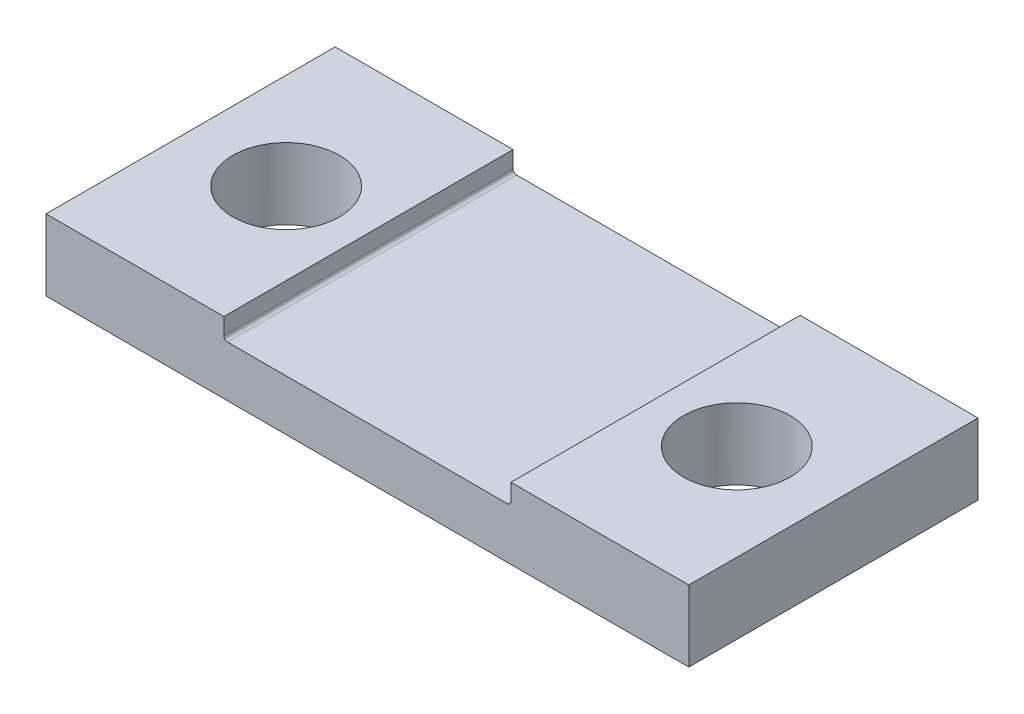
ISO-10303-21;
HEADER;
FILE_DESCRIPTION(('STEP AP214'),'2;1');
FILE_NAME('part.step','',(''),(''),'','','');
FILE_SCHEMA(('AUTOMOTIVE_DESIGN { 1 0 10303 214 1 1 1 1 }'));
ENDSEC;
DATA;
#1=APPLICATION_CONTEXT('core data for automotive mechanical design processes');
#2=APPLICATION_PROTOCOL_DEFINITION('international standard','automotive_design',2000,#1);
#3=PRODUCT_CONTEXT('',#1,'mechanical');
#4=PRODUCT('Part','Part','',(#3));
#5=PRODUCT_RELATED_PRODUCT_CATEGORY('part','',(#4));
#6=PRODUCT_DEFINITION_FORMATION('','',#4);
#7=PRODUCT_DEFINITION_CONTEXT('part definition',#1,'design');
#8=PRODUCT_DEFINITION('design','',#6,#7);
#9=PRODUCT_DEFINITION_SHAPE('','',#8);
#10=(LENGTH_UNIT() NAMED_UNIT(*) SI_UNIT(.MILLI.,.METRE.));
#11=(NAMED_UNIT(*) PLANE_ANGLE_UNIT() SI_UNIT($,.RADIAN.));
#12=(NAMED_UNIT(*) SI_UNIT($,.STERADIAN.) SOLID_ANGLE_UNIT());
#13=UNCERTAINTY_MEASURE_WITH_UNIT(LENGTH_MEASURE(1.E-05),#10,'distance_accuracy_value','');
#14=(GEOMETRIC_REPRESENTATION_CONTEXT(3) GLOBAL_UNCERTAINTY_ASSIGNED_CONTEXT((#13)) GLOBAL_UNIT_ASSIGNED_CONTEXT((#10,
#11,#12)) REPRESENTATION_CONTEXT('',''));
#15=CARTESIAN_POINT('',(0.,0.,0.));
#16=DIRECTION('',(0.,0.,1.));
#17=DIRECTION('',(1.,0.,0.));
#18=AXIS2_PLACEMENT_3D('',#15,#16,#17);
#19=CARTESIAN_POINT('',(9.035,0.,8.13));
#20=DIRECTION('',(0.,1.,0.));
#21=DIRECTION('',(-1.,0.,0.));
#22=AXIS2_PLACEMENT_3D('',#19,#20,#21);
#23=PLANE('',#22);
#24=CARTESIAN_POINT('',(6.335,0.,4.08));
#25=DIRECTION('',(0.,1.,0.));
#26=DIRECTION('',(-1.,0.,0.));
#27=AXIS2_PLACEMENT_3D('',#24,#25,#26);
#28=CIRCLE('',#27,1.49999999999999);
#29=CARTESIAN_POINT('',(4.83500000000001,0.,4.08));
#30=VERTEX_POINT('',#29);
#31=EDGE_CURVE('E37',#30,#30,#28,.T.);
#32=ORIENTED_EDGE('',*,*,#31,.T.);
#33=EDGE_LOOP('',(#32));
#34=FACE_BOUND('',#33,.T.);
#35=CARTESIAN_POINT('',(-6.335,0.,4.08));
#36=DIRECTION('',(0.,1.,0.));
#37=DIRECTION('',(-1.,0.,0.));
#38=AXIS2_PLACEMENT_3D('',#35,#36,#37);
#39=CIRCLE('',#38,1.49999999999999);
#40=CARTESIAN_POINT('',(-7.83499999999999,0.,4.08));
#41=VERTEX_POINT('',#40);
#42=EDGE_CURVE('E147',#41,#41,#39,.T.);
#43=ORIENTED_EDGE('',*,*,#42,.T.);
#44=EDGE_LOOP('',(#43));
#45=FACE_BOUND('',#44,.T.);
#46=DIRECTION('',(1.,0.,0.));
#47=VECTOR('',#46,1.);
#48=CARTESIAN_POINT('',(9.035,0.,0.));
#49=LINE('',#48,#47);
#50=CARTESIAN_POINT('',(-9.035,0.,0.));
#51=VERTEX_POINT('',#50);
#52=CARTESIAN_POINT('',(9.035,0.,0.));
#53=VERTEX_POINT('',#52);
#54=EDGE_CURVE('E143',#51,#53,#49,.T.);
#55=ORIENTED_EDGE('',*,*,#54,.T.);
#56=DIRECTION('',(0.,0.,-1.));
#57=VECTOR('',#56,1.);
#58=CARTESIAN_POINT('',(9.035,0.,8.13));
#59=LINE('',#58,#57);
#60=CARTESIAN_POINT('',(9.035,0.,8.13));
#61=VERTEX_POINT('',#60);
#62=EDGE_CURVE('E11',#61,#53,#59,.T.);
#63=ORIENTED_EDGE('',*,*,#62,.F.);
#64=DIRECTION('',(1.,0.,0.));
#65=VECTOR('',#64,1.);
#66=CARTESIAN_POINT('',(9.035,0.,8.13));
#67=LINE('',#66,#65);
#68=CARTESIAN_POINT('',(-9.035,0.,8.13));
#69=VERTEX_POINT('',#68);
#70=EDGE_CURVE('E162',#69,#61,#67,.T.);
#71=ORIENTED_EDGE('',*,*,#70,.F.);
#72=DIRECTION('',(0.,0.,-1.));
#73=VECTOR('',#72,1.);
#74=CARTESIAN_POINT('',(-9.035,0.,8.13));
#75=LINE('',#74,#73);
#76=EDGE_CURVE('E139',#69,#51,#75,.T.);
#77=ORIENTED_EDGE('',*,*,#76,.T.);
#78=EDGE_LOOP('',(#55,#63,#71,#77));
#79=FACE_BOUND('',#78,.T.);
#80=ADVANCED_FACE('F34',(#34,#45,#79),#23,.F.);
#81=CARTESIAN_POINT('',(9.035,2.,8.13));
#82=DIRECTION('',(-1.,0.,0.));
#83=DIRECTION('',(0.,-1.,0.));
#84=AXIS2_PLACEMENT_3D('',#81,#82,#83);
#85=PLANE('',#84);
#86=DIRECTION('',(0.,1.,0.));
#87=VECTOR('',#86,1.);
#88=CARTESIAN_POINT('',(9.035,2.,0.));
#89=LINE('',#88,#87);
#90=CARTESIAN_POINT('',(9.035,2.,0.));
#91=VERTEX_POINT('',#90);
#92=EDGE_CURVE('E146',#53,#91,#89,.T.);
#93=ORIENTED_EDGE('',*,*,#92,.T.);
#94=DIRECTION('',(0.,0.,-1.));
#95=VECTOR('',#94,1.);
#96=CARTESIAN_POINT('',(9.035,2.,8.13));
#97=LINE('',#96,#95);
#98=CARTESIAN_POINT('',(9.035,2.,8.13));
#99=VERTEX_POINT('',#98);
#100=EDGE_CURVE('E43',#99,#91,#97,.T.);
#101=ORIENTED_EDGE('',*,*,#100,.F.);
#102=DIRECTION('',(0.,1.,0.));
#103=VECTOR('',#102,1.);
#104=CARTESIAN_POINT('',(9.035,2.,8.13));
#105=LINE('',#104,#103);
#106=EDGE_CURVE('E100',#61,#99,#105,.T.);
#107=ORIENTED_EDGE('',*,*,#106,.F.);
#108=ORIENTED_EDGE('',*,*,#62,.T.);
#109=EDGE_LOOP('',(#93,#101,#107,#108));
#110=FACE_BOUND('',#109,.T.);
#111=ADVANCED_FACE('F234',(#110),#85,.F.);
#112=CARTESIAN_POINT('',(4.035,2.,8.13));
#113=DIRECTION('',(0.,-1.,0.));
#114=DIRECTION('',(1.,0.,0.));
#115=AXIS2_PLACEMENT_3D('',#112,#113,#114);
#116=PLANE('',#115);
#117=CARTESIAN_POINT('',(6.335,2.,4.08));
#118=DIRECTION('',(0.,1.,0.));
#119=DIRECTION('',(0.,0.,1.));
#120=AXIS2_PLACEMENT_3D('',#117,#118,#119);
#121=CIRCLE('',#120,1.5);
#122=CARTESIAN_POINT('',(6.335,2.,5.58));
#123=VERTEX_POINT('',#122);
#124=EDGE_CURVE('E215',#123,#123,#121,.T.);
#125=ORIENTED_EDGE('',*,*,#124,.F.);
#126=EDGE_LOOP('',(#125));
#127=FACE_BOUND('',#126,.T.);
#128=DIRECTION('',(-1.,0.,0.));
#129=VECTOR('',#128,1.);
#130=CARTESIAN_POINT('',(4.035,2.,0.));
#131=LINE('',#130,#129);
#132=CARTESIAN_POINT('',(4.035,2.,0.));
#133=VERTEX_POINT('',#132);
#134=EDGE_CURVE('E149',#91,#133,#131,.T.);
#135=ORIENTED_EDGE('',*,*,#134,.T.);
#136=DIRECTION('',(0.,0.,-1.));
#137=VECTOR('',#136,1.);
#138=CARTESIAN_POINT('',(4.035,2.,8.13));
#139=LINE('',#138,#137);
#140=CARTESIAN_POINT('',(4.035,2.,8.13));
#141=VERTEX_POINT('',#140);
#142=EDGE_CURVE('E175',#141,#133,#139,.T.);
#143=ORIENTED_EDGE('',*,*,#142,.F.);
#144=DIRECTION('',(-1.,0.,0.));
#145=VECTOR('',#144,1.);
#146=CARTESIAN_POINT('',(4.035,2.,8.13));
#147=LINE('',#146,#145);
#148=EDGE_CURVE('E184',#99,#141,#147,.T.);
#149=ORIENTED_EDGE('',*,*,#148,.F.);
#150=ORIENTED_EDGE('',*,*,#100,.T.);
#151=EDGE_LOOP('',(#135,#143,#149,#150));
#152=FACE_BOUND('',#151,.T.);
#153=ADVANCED_FACE('F182',(#127,#152),#116,.F.);
#154=CARTESIAN_POINT('',(4.035,1.53,8.13));
#155=DIRECTION('',(1.,0.,0.));
#156=DIRECTION('',(0.,1.,0.));
#157=AXIS2_PLACEMENT_3D('',#154,#155,#156);
#158=PLANE('',#157);
#159=DIRECTION('',(0.,-1.,0.));
#160=VECTOR('',#159,1.);
#161=CARTESIAN_POINT('',(4.035,1.53,0.));
#162=LINE('',#161,#160);
#163=CARTESIAN_POINT('',(4.035,1.53,0.));
#164=VERTEX_POINT('',#163);
#165=EDGE_CURVE('E151',#133,#164,#162,.T.);
#166=ORIENTED_EDGE('',*,*,#165,.T.);
#167=DIRECTION('',(0.,0.,-1.));
#168=VECTOR('',#167,1.);
#169=CARTESIAN_POINT('',(4.035,1.53,8.13));
#170=LINE('',#169,#168);
#171=CARTESIAN_POINT('',(4.035,1.53,8.13));
#172=VERTEX_POINT('',#171);
#173=EDGE_CURVE('E172',#172,#164,#170,.T.);
#174=ORIENTED_EDGE('',*,*,#173,.F.);
#175=DIRECTION('',(0.,-1.,0.));
#176=VECTOR('',#175,1.);
#177=CARTESIAN_POINT('',(4.035,1.53,8.13));
#178=LINE('',#177,#176);
#179=EDGE_CURVE('E202',#141,#172,#178,.T.);
#180=ORIENTED_EDGE('',*,*,#179,.F.);
#181=ORIENTED_EDGE('',*,*,#142,.T.);
#182=EDGE_LOOP('',(#166,#174,#180,#181));
#183=FACE_BOUND('',#182,.T.);
#184=ADVANCED_FACE('F193',(#183),#158,.F.);
#185=CARTESIAN_POINT('',(3.935,1.53,8.13));
#186=DIRECTION('',(0.,0.,-1.));
#187=DIRECTION('',(-1.,0.,0.));
#188=AXIS2_PLACEMENT_3D('',#185,#186,#187);
#189=CYLINDRICAL_SURFACE('',#188,0.100000000000001);
#190=CARTESIAN_POINT('',(3.935,1.53,0.));
#191=DIRECTION('',(0.,0.,-1.));
#192=DIRECTION('',(1.,0.,0.));
#193=AXIS2_PLACEMENT_3D('',#190,#191,#192);
#194=CIRCLE('',#193,0.100000000000001);
#195=CARTESIAN_POINT('',(3.935,1.43,0.));
#196=VERTEX_POINT('',#195);
#197=EDGE_CURVE('E153',#164,#196,#194,.T.);
#198=ORIENTED_EDGE('',*,*,#197,.T.);
#199=DIRECTION('',(0.,0.,-1.));
#200=VECTOR('',#199,1.);
#201=CARTESIAN_POINT('',(3.935,1.43,8.13));
#202=LINE('',#201,#200);
#203=CARTESIAN_POINT('',(3.935,1.43,8.13));
#204=VERTEX_POINT('',#203);
#205=EDGE_CURVE('E169',#204,#196,#202,.T.);
#206=ORIENTED_EDGE('',*,*,#205,.F.);
#207=CARTESIAN_POINT('',(3.935,1.53,8.13));
#208=DIRECTION('',(0.,0.,-1.));
#209=DIRECTION('',(1.,0.,0.));
#210=AXIS2_PLACEMENT_3D('',#207,#208,#209);
#211=CIRCLE('',#210,0.100000000000001);
#212=EDGE_CURVE('E199',#172,#204,#211,.T.);
#213=ORIENTED_EDGE('',*,*,#212,.F.);
#214=ORIENTED_EDGE('',*,*,#173,.T.);
#215=EDGE_LOOP('',(#198,#206,#213,#214));
#216=FACE_BOUND('',#215,.T.);
#217=ADVANCED_FACE('F197',(#216),#189,.F.);
#218=CARTESIAN_POINT('',(-3.935,1.43,8.13));
#219=DIRECTION('',(0.,-1.,0.));
#220=DIRECTION('',(0.,0.,-1.));
#221=AXIS2_PLACEMENT_3D('',#218,#219,#220);
#222=PLANE('',#221);
#223=DIRECTION('',(-1.,0.,0.));
#224=VECTOR('',#223,1.);
#225=CARTESIAN_POINT('',(-3.935,1.43,0.));
#226=LINE('',#225,#224);
#227=CARTESIAN_POINT('',(-3.935,1.43,0.));
#228=VERTEX_POINT('',#227);
#229=EDGE_CURVE('E155',#196,#228,#226,.T.);
#230=ORIENTED_EDGE('',*,*,#229,.T.);
#231=DIRECTION('',(0.,0.,-1.));
#232=VECTOR('',#231,1.);
#233=CARTESIAN_POINT('',(-3.935,1.43,8.13));
#234=LINE('',#233,#232);
#235=CARTESIAN_POINT('',(-3.935,1.43,8.13));
#236=VERTEX_POINT('',#235);
#237=EDGE_CURVE('E166',#236,#228,#234,.T.);
#238=ORIENTED_EDGE('',*,*,#237,.F.);
#239=DIRECTION('',(-1.,0.,0.));
#240=VECTOR('',#239,1.);
#241=CARTESIAN_POINT('',(-3.935,1.43,8.13));
#242=LINE('',#241,#240);
#243=EDGE_CURVE('E201',#204,#236,#242,.T.);
#244=ORIENTED_EDGE('',*,*,#243,.F.);
#245=ORIENTED_EDGE('',*,*,#205,.T.);
#246=EDGE_LOOP('',(#230,#238,#244,#245));
#247=FACE_BOUND('',#246,.T.);
#248=ADVANCED_FACE('F248',(#247),#222,.F.);
#249=CARTESIAN_POINT('',(-3.935,1.53,8.13));
#250=DIRECTION('',(0.,0.,-1.));
#251=DIRECTION('',(-1.,0.,0.));
#252=AXIS2_PLACEMENT_3D('',#249,#250,#251);
#253=CYLINDRICAL_SURFACE('',#252,0.1);
#254=CARTESIAN_POINT('',(-3.935,1.53,0.));
#255=DIRECTION('',(0.,0.,-1.));
#256=DIRECTION('',(1.,0.,0.));
#257=AXIS2_PLACEMENT_3D('',#254,#255,#256);
#258=CIRCLE('',#257,0.1);
#259=CARTESIAN_POINT('',(-4.035,1.53,0.));
#260=VERTEX_POINT('',#259);
#261=EDGE_CURVE('E157',#228,#260,#258,.T.);
#262=ORIENTED_EDGE('',*,*,#261,.T.);
#263=DIRECTION('',(0.,0.,-1.));
#264=VECTOR('',#263,1.);
#265=CARTESIAN_POINT('',(-4.035,1.53,8.13));
#266=LINE('',#265,#264);
#267=CARTESIAN_POINT('',(-4.035,1.53,8.13));
#268=VERTEX_POINT('',#267);
#269=EDGE_CURVE('E134',#268,#260,#266,.T.);
#270=ORIENTED_EDGE('',*,*,#269,.F.);
#271=CARTESIAN_POINT('',(-3.935,1.53,8.13));
#272=DIRECTION('',(0.,0.,-1.));
#273=DIRECTION('',(1.,0.,0.));
#274=AXIS2_PLACEMENT_3D('',#271,#272,#273);
#275=CIRCLE('',#274,0.1);
#276=EDGE_CURVE('E125',#236,#268,#275,.T.);
#277=ORIENTED_EDGE('',*,*,#276,.F.);
#278=ORIENTED_EDGE('',*,*,#237,.T.);
#279=EDGE_LOOP('',(#262,#270,#277,#278));
#280=FACE_BOUND('',#279,.T.);
#281=ADVANCED_FACE('F251',(#280),#253,.F.);
#282=CARTESIAN_POINT('',(-4.035,2.,8.13));
#283=DIRECTION('',(-1.,0.,0.));
#284=DIRECTION('',(0.,0.,1.));
#285=AXIS2_PLACEMENT_3D('',#282,#283,#284);
#286=PLANE('',#285);
#287=DIRECTION('',(0.,1.,0.));
#288=VECTOR('',#287,1.);
#289=CARTESIAN_POINT('',(-4.035,2.,0.));
#290=LINE('',#289,#288);
#291=CARTESIAN_POINT('',(-4.035,2.,0.));
#292=VERTEX_POINT('',#291);
#293=EDGE_CURVE('E133',#260,#292,#290,.T.);
#294=ORIENTED_EDGE('',*,*,#293,.T.);
#295=DIRECTION('',(0.,0.,-1.));
#296=VECTOR('',#295,1.);
#297=CARTESIAN_POINT('',(-4.035,2.,8.13));
#298=LINE('',#297,#296);
#299=CARTESIAN_POINT('',(-4.035,2.,8.13));
#300=VERTEX_POINT('',#299);
#301=EDGE_CURVE('E130',#300,#292,#298,.T.);
#302=ORIENTED_EDGE('',*,*,#301,.F.);
#303=DIRECTION('',(0.,1.,0.));
#304=VECTOR('',#303,1.);
#305=CARTESIAN_POINT('',(-4.035,2.,8.13));
#306=LINE('',#305,#304);
#307=EDGE_CURVE('E119',#268,#300,#306,.T.);
#308=ORIENTED_EDGE('',*,*,#307,.F.);
#309=ORIENTED_EDGE('',*,*,#269,.T.);
#310=EDGE_LOOP('',(#294,#302,#308,#309));
#311=FACE_BOUND('',#310,.T.);
#312=ADVANCED_FACE('F131',(#311),#286,.F.);
#313=CARTESIAN_POINT('',(-9.035,2.,8.13));
#314=DIRECTION('',(0.,-1.,0.));
#315=DIRECTION('',(1.,0.,0.));
#316=AXIS2_PLACEMENT_3D('',#313,#314,#315);
#317=PLANE('',#316);
#318=CARTESIAN_POINT('',(-6.335,1.99999999999998,4.08));
#319=DIRECTION('',(0.,1.,0.));
#320=DIRECTION('',(0.,0.,1.));
#321=AXIS2_PLACEMENT_3D('',#318,#319,#320);
#322=CIRCLE('',#321,1.5);
#323=CARTESIAN_POINT('',(-6.335,1.99999999999998,5.58));
#324=VERTEX_POINT('',#323);
#325=EDGE_CURVE('E212',#324,#324,#322,.T.);
#326=ORIENTED_EDGE('',*,*,#325,.F.);
#327=EDGE_LOOP('',(#326));
#328=FACE_BOUND('',#327,.T.);
#329=DIRECTION('',(-1.,0.,0.));
#330=VECTOR('',#329,1.);
#331=CARTESIAN_POINT('',(-9.035,2.,0.));
#332=LINE('',#331,#330);
#333=CARTESIAN_POINT('',(-9.035,2.,0.));
#334=VERTEX_POINT('',#333);
#335=EDGE_CURVE('E86',#292,#334,#332,.T.);
#336=ORIENTED_EDGE('',*,*,#335,.T.);
#337=DIRECTION('',(0.,0.,-1.));
#338=VECTOR('',#337,1.);
#339=CARTESIAN_POINT('',(-9.035,2.,8.13));
#340=LINE('',#339,#338);
#341=CARTESIAN_POINT('',(-9.035,2.,8.13));
#342=VERTEX_POINT('',#341);
#343=EDGE_CURVE('E135',#342,#334,#340,.T.);
#344=ORIENTED_EDGE('',*,*,#343,.F.);
#345=DIRECTION('',(-1.,0.,0.));
#346=VECTOR('',#345,1.);
#347=CARTESIAN_POINT('',(-9.035,2.,8.13));
#348=LINE('',#347,#346);
#349=EDGE_CURVE('E123',#300,#342,#348,.T.);
#350=ORIENTED_EDGE('',*,*,#349,.F.);
#351=ORIENTED_EDGE('',*,*,#301,.T.);
#352=EDGE_LOOP('',(#336,#344,#350,#351));
#353=FACE_BOUND('',#352,.T.);
#354=ADVANCED_FACE('F137',(#328,#353),#317,.F.);
#355=CARTESIAN_POINT('',(-9.035,0.,8.13));
#356=DIRECTION('',(1.,0.,0.));
#357=DIRECTION('',(0.,1.,0.));
#358=AXIS2_PLACEMENT_3D('',#355,#356,#357);
#359=PLANE('',#358);
#360=DIRECTION('',(0.,-1.,0.));
#361=VECTOR('',#360,1.);
#362=CARTESIAN_POINT('',(-9.035,0.,0.));
#363=LINE('',#362,#361);
#364=EDGE_CURVE('E92',#334,#51,#363,.T.);
#365=ORIENTED_EDGE('',*,*,#364,.T.);
#366=ORIENTED_EDGE('',*,*,#76,.F.);
#367=DIRECTION('',(0.,-1.,0.));
#368=VECTOR('',#367,1.);
#369=CARTESIAN_POINT('',(-9.035,0.,8.13));
#370=LINE('',#369,#368);
#371=EDGE_CURVE('E51',#342,#69,#370,.T.);
#372=ORIENTED_EDGE('',*,*,#371,.F.);
#373=ORIENTED_EDGE('',*,*,#343,.T.);
#374=EDGE_LOOP('',(#365,#366,#372,#373));
#375=FACE_BOUND('',#374,.T.);
#376=ADVANCED_FACE('F260',(#375),#359,.F.);
#377=CARTESIAN_POINT('',(-3.935,1.53,8.13));
#378=DIRECTION('',(0.,0.,1.));
#379=DIRECTION('',(1.,0.,0.));
#380=AXIS2_PLACEMENT_3D('',#377,#378,#379);
#381=PLANE('',#380);
#382=ORIENTED_EDGE('',*,*,#70,.T.);
#383=ORIENTED_EDGE('',*,*,#106,.T.);
#384=ORIENTED_EDGE('',*,*,#148,.T.);
#385=ORIENTED_EDGE('',*,*,#179,.T.);
#386=ORIENTED_EDGE('',*,*,#212,.T.);
#387=ORIENTED_EDGE('',*,*,#243,.T.);
#388=ORIENTED_EDGE('',*,*,#276,.T.);
#389=ORIENTED_EDGE('',*,*,#307,.T.);
#390=ORIENTED_EDGE('',*,*,#349,.T.);
#391=ORIENTED_EDGE('',*,*,#371,.T.);
#392=EDGE_LOOP('',(#382,#383,#384,#385,#386,#387,#388,#389,#390,#391));
#393=FACE_BOUND('',#392,.T.);
#394=ADVANCED_FACE('F121',(#393),#381,.T.);
#395=CARTESIAN_POINT('',(-3.935,1.53,0.));
#396=DIRECTION('',(0.,0.,1.));
#397=DIRECTION('',(1.,0.,0.));
#398=AXIS2_PLACEMENT_3D('',#395,#396,#397);
#399=PLANE('',#398);
#400=ORIENTED_EDGE('',*,*,#54,.F.);
#401=ORIENTED_EDGE('',*,*,#364,.F.);
#402=ORIENTED_EDGE('',*,*,#335,.F.);
#403=ORIENTED_EDGE('',*,*,#293,.F.);
#404=ORIENTED_EDGE('',*,*,#261,.F.);
#405=ORIENTED_EDGE('',*,*,#229,.F.);
#406=ORIENTED_EDGE('',*,*,#197,.F.);
#407=ORIENTED_EDGE('',*,*,#165,.F.);
#408=ORIENTED_EDGE('',*,*,#134,.F.);
#409=ORIENTED_EDGE('',*,*,#92,.F.);
#410=EDGE_LOOP('',(#400,#401,#402,#403,#404,#405,#406,#407,#408,#409));
#411=FACE_BOUND('',#410,.T.);
#412=ADVANCED_FACE('F188',(#411),#399,.F.);
#413=CARTESIAN_POINT('',(-6.335,1.99999999999998,4.08));
#414=DIRECTION('',(0.,1.,0.));
#415=DIRECTION('',(0.,0.,1.));
#416=AXIS2_PLACEMENT_3D('',#413,#414,#415);
#417=CYLINDRICAL_SURFACE('',#416,1.49999999999999);
#418=ORIENTED_EDGE('',*,*,#325,.T.);
#419=EDGE_LOOP('',(#418));
#420=FACE_BOUND('',#419,.T.);
#421=ORIENTED_EDGE('',*,*,#42,.F.);
#422=EDGE_LOOP('',(#421));
#423=FACE_BOUND('',#422,.T.);
#424=ADVANCED_FACE('F226',(#420,#423),#417,.F.);
#425=CARTESIAN_POINT('',(6.335,2.,4.08));
#426=DIRECTION('',(0.,1.,0.));
#427=DIRECTION('',(0.,0.,1.));
#428=AXIS2_PLACEMENT_3D('',#425,#426,#427);
#429=CYLINDRICAL_SURFACE('',#428,1.49999999999999);
#430=ORIENTED_EDGE('',*,*,#124,.T.);
#431=EDGE_LOOP('',(#430));
#432=FACE_BOUND('',#431,.T.);
#433=ORIENTED_EDGE('',*,*,#31,.F.);
#434=EDGE_LOOP('',(#433));
#435=FACE_BOUND('',#434,.T.);
#436=ADVANCED_FACE('F224',(#432,#435),#429,.F.);
#437=CLOSED_SHELL('',(#80,#111,#153,#184,#217,#248,#281,#312,#354,#376,#394,#412,#424,#436));
#438=MANIFOLD_SOLID_BREP('B2',#437);
#439=ADVANCED_BREP_SHAPE_REPRESENTATION('',(#18,#438),#14);
#440=SHAPE_DEFINITION_REPRESENTATION(#9,#439);
ENDSEC;
END-ISO-10303-21;
